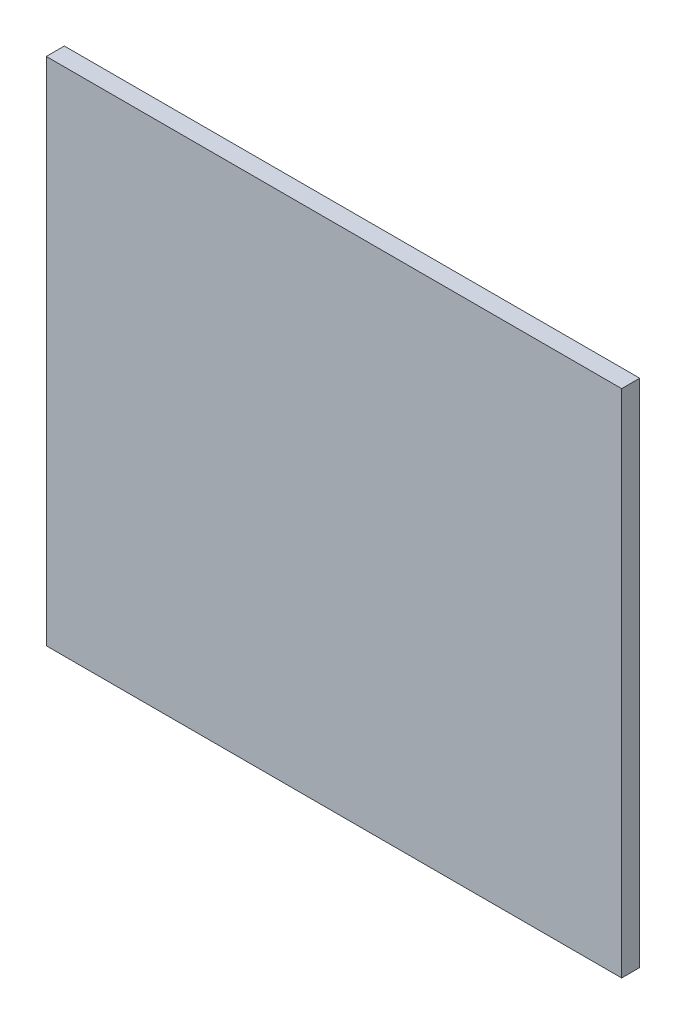
ISO-10303-21;
HEADER;
FILE_DESCRIPTION(('STEP AP214'),'2;1');
FILE_NAME('part.step','',(''),(''),'','','');
FILE_SCHEMA(('AUTOMOTIVE_DESIGN { 1 0 10303 214 1 1 1 1 }'));
ENDSEC;
DATA;
#1=APPLICATION_CONTEXT('core data for automotive mechanical design processes');
#2=APPLICATION_PROTOCOL_DEFINITION('international standard','automotive_design',2000,#1);
#3=PRODUCT_CONTEXT('',#1,'mechanical');
#4=PRODUCT('Part','Part','',(#3));
#5=PRODUCT_RELATED_PRODUCT_CATEGORY('part','',(#4));
#6=PRODUCT_DEFINITION_FORMATION('','',#4);
#7=PRODUCT_DEFINITION_CONTEXT('part definition',#1,'design');
#8=PRODUCT_DEFINITION('design','',#6,#7);
#9=PRODUCT_DEFINITION_SHAPE('','',#8);
#10=(LENGTH_UNIT() NAMED_UNIT(*) SI_UNIT(.MILLI.,.METRE.));
#11=(NAMED_UNIT(*) PLANE_ANGLE_UNIT() SI_UNIT($,.RADIAN.));
#12=(NAMED_UNIT(*) SI_UNIT($,.STERADIAN.) SOLID_ANGLE_UNIT());
#13=UNCERTAINTY_MEASURE_WITH_UNIT(LENGTH_MEASURE(1.E-05),#10,'distance_accuracy_value','');
#14=(GEOMETRIC_REPRESENTATION_CONTEXT(3) GLOBAL_UNCERTAINTY_ASSIGNED_CONTEXT((#13)) GLOBAL_UNIT_ASSIGNED_CONTEXT((#10,
#11,#12)) REPRESENTATION_CONTEXT('',''));
#15=CARTESIAN_POINT('',(0.,0.,0.));
#16=DIRECTION('',(0.,0.,1.));
#17=DIRECTION('',(1.,0.,0.));
#18=AXIS2_PLACEMENT_3D('',#15,#16,#17);
#19=CARTESIAN_POINT('',(-400.,-1.77635683940025E-12,-12.5));
#20=DIRECTION('',(-1.,0.,0.));
#21=DIRECTION('',(0.,-1.,0.));
#22=AXIS2_PLACEMENT_3D('',#19,#20,#21);
#23=PLANE('',#22);
#24=DIRECTION('',(0.,-1.,0.));
#25=VECTOR('',#24,1.);
#26=CARTESIAN_POINT('',(-400.,-1.77635683940025E-12,0.));
#27=LINE('',#26,#25);
#28=CARTESIAN_POINT('',(-400.,-1.77635683940025E-12,0.));
#29=VERTEX_POINT('',#28);
#30=CARTESIAN_POINT('',(-400.,-353.5,0.));
#31=VERTEX_POINT('',#30);
#32=EDGE_CURVE('E100',#29,#31,#27,.T.);
#33=ORIENTED_EDGE('',*,*,#32,.F.);
#34=DIRECTION('',(0.,0.,1.));
#35=VECTOR('',#34,1.);
#36=CARTESIAN_POINT('',(-400.,-1.77635683940025E-12,-12.5));
#37=LINE('',#36,#35);
#38=CARTESIAN_POINT('',(-400.,-1.77635683940025E-12,-12.5));
#39=VERTEX_POINT('',#38);
#40=EDGE_CURVE('E11',#39,#29,#37,.T.);
#41=ORIENTED_EDGE('',*,*,#40,.F.);
#42=DIRECTION('',(0.,-1.,0.));
#43=VECTOR('',#42,1.);
#44=CARTESIAN_POINT('',(-400.,-1.77635683940025E-12,-12.5));
#45=LINE('',#44,#43);
#46=CARTESIAN_POINT('',(-400.,-353.5,-12.5));
#47=VERTEX_POINT('',#46);
#48=EDGE_CURVE('E94',#39,#47,#45,.T.);
#49=ORIENTED_EDGE('',*,*,#48,.T.);
#50=DIRECTION('',(0.,0.,1.));
#51=VECTOR('',#50,1.);
#52=CARTESIAN_POINT('',(-400.,-353.5,-12.5));
#53=LINE('',#52,#51);
#54=EDGE_CURVE('E39',#47,#31,#53,.T.);
#55=ORIENTED_EDGE('',*,*,#54,.T.);
#56=EDGE_LOOP('',(#33,#41,#49,#55));
#57=FACE_BOUND('',#56,.T.);
#58=ADVANCED_FACE('F36',(#57),#23,.T.);
#59=CARTESIAN_POINT('',(-400.,-1.77635683940025E-12,-12.5));
#60=DIRECTION('',(0.,1.,0.));
#61=DIRECTION('',(-1.,0.,0.));
#62=AXIS2_PLACEMENT_3D('',#59,#60,#61);
#63=PLANE('',#62);
#64=DIRECTION('',(-1.,0.,0.));
#65=VECTOR('',#64,1.);
#66=CARTESIAN_POINT('',(-400.,-1.77635683940025E-12,0.));
#67=LINE('',#66,#65);
#68=CARTESIAN_POINT('',(-1.49999999999961,0.,0.));
#69=VERTEX_POINT('',#68);
#70=EDGE_CURVE('E96',#69,#29,#67,.T.);
#71=ORIENTED_EDGE('',*,*,#70,.F.);
#72=DIRECTION('',(0.,0.,1.));
#73=VECTOR('',#72,1.);
#74=CARTESIAN_POINT('',(-1.49999999999961,0.,-12.5));
#75=LINE('',#74,#73);
#76=CARTESIAN_POINT('',(-1.49999999999961,0.,-12.5));
#77=VERTEX_POINT('',#76);
#78=EDGE_CURVE('E45',#77,#69,#75,.T.);
#79=ORIENTED_EDGE('',*,*,#78,.F.);
#80=DIRECTION('',(-1.,0.,0.));
#81=VECTOR('',#80,1.);
#82=CARTESIAN_POINT('',(-400.,-1.77635683940025E-12,-12.5));
#83=LINE('',#82,#81);
#84=EDGE_CURVE('E91',#77,#39,#83,.T.);
#85=ORIENTED_EDGE('',*,*,#84,.T.);
#86=ORIENTED_EDGE('',*,*,#40,.T.);
#87=EDGE_LOOP('',(#71,#79,#85,#86));
#88=FACE_BOUND('',#87,.T.);
#89=ADVANCED_FACE('F110',(#88),#63,.T.);
#90=CARTESIAN_POINT('',(-1.49999999999961,0.,-12.5));
#91=DIRECTION('',(1.,0.,0.));
#92=DIRECTION('',(0.,1.,0.));
#93=AXIS2_PLACEMENT_3D('',#90,#91,#92);
#94=PLANE('',#93);
#95=DIRECTION('',(0.,1.,0.));
#96=VECTOR('',#95,1.);
#97=CARTESIAN_POINT('',(-1.49999999999961,0.,0.));
#98=LINE('',#97,#96);
#99=CARTESIAN_POINT('',(-1.49999999999959,-353.5,0.));
#100=VERTEX_POINT('',#99);
#101=EDGE_CURVE('E86',#100,#69,#98,.T.);
#102=ORIENTED_EDGE('',*,*,#101,.F.);
#103=DIRECTION('',(0.,0.,1.));
#104=VECTOR('',#103,1.);
#105=CARTESIAN_POINT('',(-1.49999999999959,-353.5,-12.5));
#106=LINE('',#105,#104);
#107=CARTESIAN_POINT('',(-1.49999999999959,-353.5,-12.5));
#108=VERTEX_POINT('',#107);
#109=EDGE_CURVE('E81',#108,#100,#106,.T.);
#110=ORIENTED_EDGE('',*,*,#109,.F.);
#111=DIRECTION('',(0.,1.,0.));
#112=VECTOR('',#111,1.);
#113=CARTESIAN_POINT('',(-1.49999999999961,0.,-12.5));
#114=LINE('',#113,#112);
#115=EDGE_CURVE('E84',#108,#77,#114,.T.);
#116=ORIENTED_EDGE('',*,*,#115,.T.);
#117=ORIENTED_EDGE('',*,*,#78,.T.);
#118=EDGE_LOOP('',(#102,#110,#116,#117));
#119=FACE_BOUND('',#118,.T.);
#120=ADVANCED_FACE('F83',(#119),#94,.T.);
#121=CARTESIAN_POINT('',(-400.,-353.5,-12.5));
#122=DIRECTION('',(0.,-1.,0.));
#123=DIRECTION('',(0.,0.,-1.));
#124=AXIS2_PLACEMENT_3D('',#121,#122,#123);
#125=PLANE('',#124);
#126=DIRECTION('',(1.,0.,0.));
#127=VECTOR('',#126,1.);
#128=CARTESIAN_POINT('',(-400.,-353.5,0.));
#129=LINE('',#128,#127);
#130=EDGE_CURVE('E103',#31,#100,#129,.T.);
#131=ORIENTED_EDGE('',*,*,#130,.F.);
#132=ORIENTED_EDGE('',*,*,#54,.F.);
#133=DIRECTION('',(1.,0.,0.));
#134=VECTOR('',#133,1.);
#135=CARTESIAN_POINT('',(-400.,-353.5,-12.5));
#136=LINE('',#135,#134);
#137=EDGE_CURVE('E90',#47,#108,#136,.T.);
#138=ORIENTED_EDGE('',*,*,#137,.T.);
#139=ORIENTED_EDGE('',*,*,#109,.T.);
#140=EDGE_LOOP('',(#131,#132,#138,#139));
#141=FACE_BOUND('',#140,.T.);
#142=ADVANCED_FACE('F93',(#141),#125,.T.);
#143=CARTESIAN_POINT('',(0.,0.,-12.5));
#144=DIRECTION('',(0.,0.,1.));
#145=DIRECTION('',(1.,0.,0.));
#146=AXIS2_PLACEMENT_3D('',#143,#144,#145);
#147=PLANE('',#146);
#148=ORIENTED_EDGE('',*,*,#48,.F.);
#149=ORIENTED_EDGE('',*,*,#84,.F.);
#150=ORIENTED_EDGE('',*,*,#115,.F.);
#151=ORIENTED_EDGE('',*,*,#137,.F.);
#152=EDGE_LOOP('',(#148,#149,#150,#151));
#153=FACE_BOUND('',#152,.T.);
#154=ADVANCED_FACE('F89',(#153),#147,.F.);
#155=CARTESIAN_POINT('',(0.,0.,0.));
#156=DIRECTION('',(0.,0.,1.));
#157=DIRECTION('',(1.,0.,0.));
#158=AXIS2_PLACEMENT_3D('',#155,#156,#157);
#159=PLANE('',#158);
#160=ORIENTED_EDGE('',*,*,#32,.T.);
#161=ORIENTED_EDGE('',*,*,#130,.T.);
#162=ORIENTED_EDGE('',*,*,#101,.T.);
#163=ORIENTED_EDGE('',*,*,#70,.T.);
#164=EDGE_LOOP('',(#160,#161,#162,#163));
#165=FACE_BOUND('',#164,.T.);
#166=ADVANCED_FACE('F109',(#165),#159,.T.);
#167=CLOSED_SHELL('',(#58,#89,#120,#142,#154,#166));
#168=MANIFOLD_SOLID_BREP('B2',#167);
#169=ADVANCED_BREP_SHAPE_REPRESENTATION('',(#18,#168),#14);
#170=SHAPE_DEFINITION_REPRESENTATION(#9,#169);
ENDSEC;
END-ISO-10303-21;
